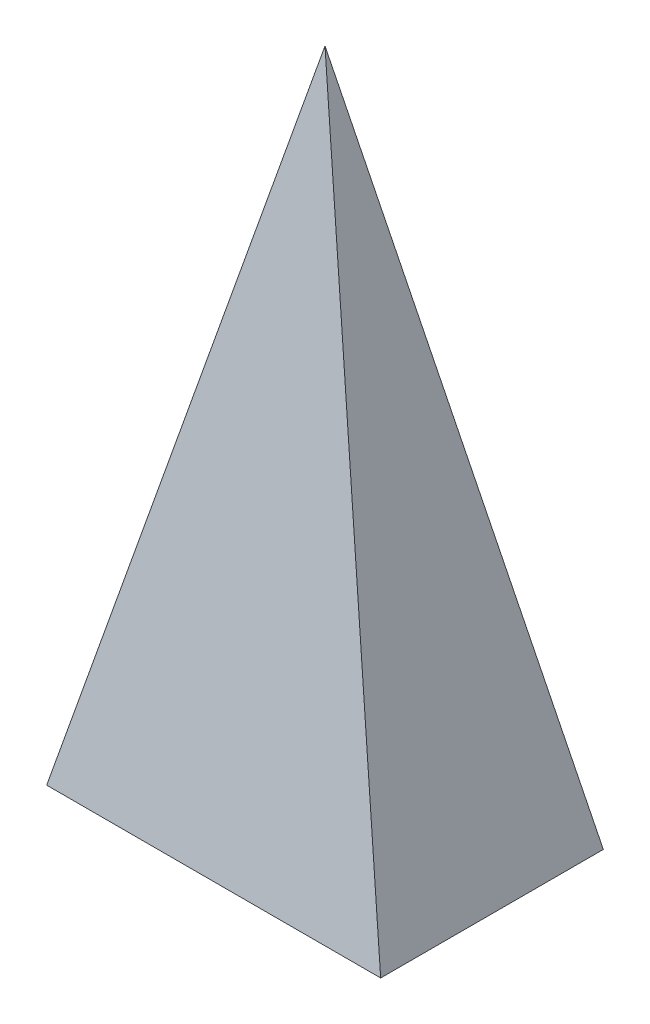
ISO-10303-21;
HEADER;
FILE_DESCRIPTION(('STEP AP214'),'2;1');
FILE_NAME('part.step','',(''),(''),'','','');
FILE_SCHEMA(('AUTOMOTIVE_DESIGN { 1 0 10303 214 1 1 1 1 }'));
ENDSEC;
DATA;
#1=APPLICATION_CONTEXT('core data for automotive mechanical design processes');
#2=APPLICATION_PROTOCOL_DEFINITION('international standard','automotive_design',2000,#1);
#3=PRODUCT_CONTEXT('',#1,'mechanical');
#4=PRODUCT('Part','Part','',(#3));
#5=PRODUCT_RELATED_PRODUCT_CATEGORY('part','',(#4));
#6=PRODUCT_DEFINITION_FORMATION('','',#4);
#7=PRODUCT_DEFINITION_CONTEXT('part definition',#1,'design');
#8=PRODUCT_DEFINITION('design','',#6,#7);
#9=PRODUCT_DEFINITION_SHAPE('','',#8);
#10=(LENGTH_UNIT() NAMED_UNIT(*) SI_UNIT(.MILLI.,.METRE.));
#11=(NAMED_UNIT(*) PLANE_ANGLE_UNIT() SI_UNIT($,.RADIAN.));
#12=(NAMED_UNIT(*) SI_UNIT($,.STERADIAN.) SOLID_ANGLE_UNIT());
#13=UNCERTAINTY_MEASURE_WITH_UNIT(LENGTH_MEASURE(1.E-05),#10,'distance_accuracy_value','');
#14=(GEOMETRIC_REPRESENTATION_CONTEXT(3) GLOBAL_UNCERTAINTY_ASSIGNED_CONTEXT((#13)) GLOBAL_UNIT_ASSIGNED_CONTEXT((#10,
#11,#12)) REPRESENTATION_CONTEXT('',''));
#15=CARTESIAN_POINT('',(0.,0.,0.));
#16=DIRECTION('',(0.,0.,1.));
#17=DIRECTION('',(1.,0.,0.));
#18=AXIS2_PLACEMENT_3D('',#15,#16,#17);
#19=CARTESIAN_POINT('',(0.,0.,0.));
#20=DIRECTION('',(0.,1.,0.));
#21=DIRECTION('',(0.,0.,1.));
#22=AXIS2_PLACEMENT_3D('',#19,#20,#21);
#23=PLANE('',#22);
#24=DIRECTION('',(0.,0.,1.));
#25=VECTOR('',#24,1.);
#26=CARTESIAN_POINT('',(-750.,0.,500.));
#27=LINE('',#26,#25);
#28=CARTESIAN_POINT('',(-750.,0.,-500.));
#29=VERTEX_POINT('',#28);
#30=CARTESIAN_POINT('',(-750.,0.,500.));
#31=VERTEX_POINT('',#30);
#32=EDGE_CURVE('E133',#29,#31,#27,.T.);
#33=ORIENTED_EDGE('',*,*,#32,.F.);
#34=DIRECTION('',(-1.,0.,0.));
#35=VECTOR('',#34,1.);
#36=CARTESIAN_POINT('',(750.,0.,-500.));
#37=LINE('',#36,#35);
#38=CARTESIAN_POINT('',(750.,0.,-500.));
#39=VERTEX_POINT('',#38);
#40=EDGE_CURVE('E70',#39,#29,#37,.T.);
#41=ORIENTED_EDGE('',*,*,#40,.F.);
#42=DIRECTION('',(0.,0.,-1.));
#43=VECTOR('',#42,1.);
#44=CARTESIAN_POINT('',(750.,0.,500.));
#45=LINE('',#44,#43);
#46=CARTESIAN_POINT('',(750.,0.,500.));
#47=VERTEX_POINT('',#46);
#48=EDGE_CURVE('E63',#47,#39,#45,.T.);
#49=ORIENTED_EDGE('',*,*,#48,.F.);
#50=DIRECTION('',(1.,0.,0.));
#51=VECTOR('',#50,1.);
#52=CARTESIAN_POINT('',(750.,0.,500.));
#53=LINE('',#52,#51);
#54=EDGE_CURVE('E87',#31,#47,#53,.T.);
#55=ORIENTED_EDGE('',*,*,#54,.F.);
#56=EDGE_LOOP('',(#33,#41,#49,#55));
#57=FACE_BOUND('',#56,.T.);
#58=ADVANCED_FACE('F43',(#57),#23,.F.);
#59=CARTESIAN_POINT('',(0.,81.081081081081,486.486486486486));
#60=DIRECTION('',(0.,-0.164398987305357,-0.986393923832144));
#61=DIRECTION('',(0.,0.986393923832144,-0.164398987305357));
#62=AXIS2_PLACEMENT_3D('',#59,#60,#61);
#63=PLANE('',#62);
#64=DIRECTION('',(-0.239426065340287,0.957704261361147,-0.159617376893524));
#65=VECTOR('',#64,1.);
#66=CARTESIAN_POINT('',(750.,0.,500.));
#67=LINE('',#66,#65);
#68=CARTESIAN_POINT('',(0.,3000.,0.));
#69=VERTEX_POINT('',#68);
#70=EDGE_CURVE('E81',#47,#69,#67,.T.);
#71=ORIENTED_EDGE('',*,*,#70,.T.);
#72=DIRECTION('',(0.239426065340287,0.957704261361147,-0.159617376893524));
#73=VECTOR('',#72,1.);
#74=CARTESIAN_POINT('',(-750.,0.,500.));
#75=LINE('',#74,#73);
#76=EDGE_CURVE('E86',#31,#69,#75,.T.);
#77=ORIENTED_EDGE('',*,*,#76,.F.);
#78=ORIENTED_EDGE('',*,*,#54,.T.);
#79=EDGE_LOOP('',(#71,#77,#78));
#80=FACE_BOUND('',#79,.T.);
#81=ADVANCED_FACE('F90',(#80),#63,.F.);
#82=CARTESIAN_POINT('',(-705.882352941176,176.470588235294,0.));
#83=DIRECTION('',(0.970142500145332,-0.242535625036333,0.));
#84=DIRECTION('',(0.242535625036333,0.970142500145332,0.));
#85=AXIS2_PLACEMENT_3D('',#82,#83,#84);
#86=PLANE('',#85);
#87=ORIENTED_EDGE('',*,*,#76,.T.);
#88=DIRECTION('',(0.239426065340287,0.957704261361147,0.159617376893524));
#89=VECTOR('',#88,1.);
#90=CARTESIAN_POINT('',(-750.,0.,-500.));
#91=LINE('',#90,#89);
#92=EDGE_CURVE('E12',#29,#69,#91,.T.);
#93=ORIENTED_EDGE('',*,*,#92,.F.);
#94=ORIENTED_EDGE('',*,*,#32,.T.);
#95=EDGE_LOOP('',(#87,#93,#94));
#96=FACE_BOUND('',#95,.T.);
#97=ADVANCED_FACE('F138',(#96),#86,.F.);
#98=CARTESIAN_POINT('',(705.882352941176,176.470588235294,0.));
#99=DIRECTION('',(-0.970142500145332,-0.242535625036333,0.));
#100=DIRECTION('',(0.242535625036333,-0.970142500145332,0.));
#101=AXIS2_PLACEMENT_3D('',#98,#99,#100);
#102=PLANE('',#101);
#103=DIRECTION('',(-0.239426065340287,0.957704261361147,0.159617376893525));
#104=VECTOR('',#103,1.);
#105=CARTESIAN_POINT('',(750.,0.,-500.));
#106=LINE('',#105,#104);
#107=EDGE_CURVE('E55',#39,#69,#106,.T.);
#108=ORIENTED_EDGE('',*,*,#107,.T.);
#109=ORIENTED_EDGE('',*,*,#70,.F.);
#110=ORIENTED_EDGE('',*,*,#48,.T.);
#111=EDGE_LOOP('',(#108,#109,#110));
#112=FACE_BOUND('',#111,.T.);
#113=ADVANCED_FACE('F83',(#112),#102,.F.);
#114=CARTESIAN_POINT('',(0.,81.0810810810811,-486.486486486487));
#115=DIRECTION('',(0.,-0.164398987305357,0.986393923832144));
#116=DIRECTION('',(0.,-0.986393923832144,-0.164398987305357));
#117=AXIS2_PLACEMENT_3D('',#114,#115,#116);
#118=PLANE('',#117);
#119=ORIENTED_EDGE('',*,*,#92,.T.);
#120=ORIENTED_EDGE('',*,*,#107,.F.);
#121=ORIENTED_EDGE('',*,*,#40,.T.);
#122=EDGE_LOOP('',(#119,#120,#121));
#123=FACE_BOUND('',#122,.T.);
#124=ADVANCED_FACE('F45',(#123),#118,.F.);
#125=CLOSED_SHELL('',(#58,#81,#97,#113,#124));
#126=MANIFOLD_SOLID_BREP('B2',#125);
#127=ADVANCED_BREP_SHAPE_REPRESENTATION('',(#18,#126),#14);
#128=SHAPE_DEFINITION_REPRESENTATION(#9,#127);
ENDSEC;
END-ISO-10303-21;
